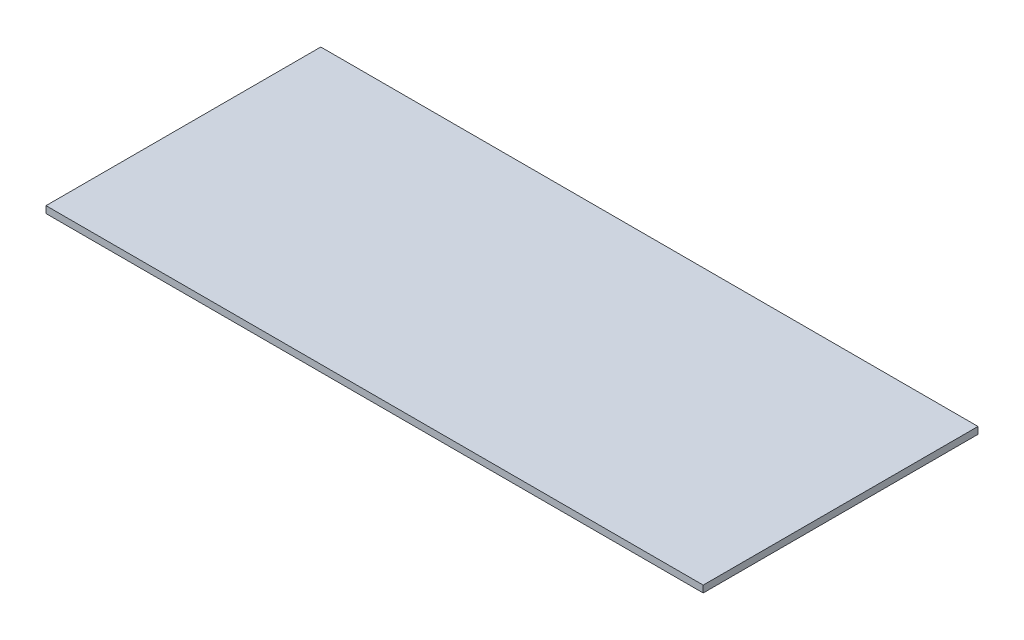
ISO-10303-21;
HEADER;
FILE_DESCRIPTION(('STEP AP214'),'2;1');
FILE_NAME('part.step','',(''),(''),'','','');
FILE_SCHEMA(('AUTOMOTIVE_DESIGN { 1 0 10303 214 1 1 1 1 }'));
ENDSEC;
DATA;
#1=APPLICATION_CONTEXT('core data for automotive mechanical design processes');
#2=APPLICATION_PROTOCOL_DEFINITION('international standard','automotive_design',2000,#1);
#3=PRODUCT_CONTEXT('',#1,'mechanical');
#4=PRODUCT('Part','Part','',(#3));
#5=PRODUCT_RELATED_PRODUCT_CATEGORY('part','',(#4));
#6=PRODUCT_DEFINITION_FORMATION('','',#4);
#7=PRODUCT_DEFINITION_CONTEXT('part definition',#1,'design');
#8=PRODUCT_DEFINITION('design','',#6,#7);
#9=PRODUCT_DEFINITION_SHAPE('','',#8);
#10=(LENGTH_UNIT() NAMED_UNIT(*) SI_UNIT(.MILLI.,.METRE.));
#11=(NAMED_UNIT(*) PLANE_ANGLE_UNIT() SI_UNIT($,.RADIAN.));
#12=(NAMED_UNIT(*) SI_UNIT($,.STERADIAN.) SOLID_ANGLE_UNIT());
#13=UNCERTAINTY_MEASURE_WITH_UNIT(LENGTH_MEASURE(1.E-05),#10,'distance_accuracy_value','');
#14=(GEOMETRIC_REPRESENTATION_CONTEXT(3) GLOBAL_UNCERTAINTY_ASSIGNED_CONTEXT((#13)) GLOBAL_UNIT_ASSIGNED_CONTEXT((#10,
#11,#12)) REPRESENTATION_CONTEXT('',''));
#15=CARTESIAN_POINT('',(0.,0.,0.));
#16=DIRECTION('',(0.,0.,1.));
#17=DIRECTION('',(1.,0.,0.));
#18=AXIS2_PLACEMENT_3D('',#15,#16,#17);
#19=CARTESIAN_POINT('',(143.5,3.,60.));
#20=DIRECTION('',(-1.,0.,0.));
#21=DIRECTION('',(0.,0.,1.));
#22=AXIS2_PLACEMENT_3D('',#19,#20,#21);
#23=PLANE('',#22);
#24=DIRECTION('',(0.,0.,-1.));
#25=VECTOR('',#24,1.);
#26=CARTESIAN_POINT('',(143.5,0.,60.));
#27=LINE('',#26,#25);
#28=CARTESIAN_POINT('',(143.5,0.,60.));
#29=VERTEX_POINT('',#28);
#30=CARTESIAN_POINT('',(143.5,0.,-60.));
#31=VERTEX_POINT('',#30);
#32=EDGE_CURVE('E100',#29,#31,#27,.T.);
#33=ORIENTED_EDGE('',*,*,#32,.T.);
#34=DIRECTION('',(0.,-1.,0.));
#35=VECTOR('',#34,1.);
#36=CARTESIAN_POINT('',(143.5,3.,-60.));
#37=LINE('',#36,#35);
#38=CARTESIAN_POINT('',(143.5,3.,-60.));
#39=VERTEX_POINT('',#38);
#40=EDGE_CURVE('E11',#39,#31,#37,.T.);
#41=ORIENTED_EDGE('',*,*,#40,.F.);
#42=DIRECTION('',(0.,0.,-1.));
#43=VECTOR('',#42,1.);
#44=CARTESIAN_POINT('',(143.5,3.,60.));
#45=LINE('',#44,#43);
#46=CARTESIAN_POINT('',(143.5,3.,60.));
#47=VERTEX_POINT('',#46);
#48=EDGE_CURVE('E88',#47,#39,#45,.T.);
#49=ORIENTED_EDGE('',*,*,#48,.F.);
#50=DIRECTION('',(0.,-1.,0.));
#51=VECTOR('',#50,1.);
#52=CARTESIAN_POINT('',(143.5,3.,60.));
#53=LINE('',#52,#51);
#54=EDGE_CURVE('E96',#47,#29,#53,.T.);
#55=ORIENTED_EDGE('',*,*,#54,.T.);
#56=EDGE_LOOP('',(#33,#41,#49,#55));
#57=FACE_BOUND('',#56,.T.);
#58=ADVANCED_FACE('F37',(#57),#23,.F.);
#59=CARTESIAN_POINT('',(-143.5,3.,-60.));
#60=DIRECTION('',(0.,0.,1.));
#61=DIRECTION('',(1.,0.,0.));
#62=AXIS2_PLACEMENT_3D('',#59,#60,#61);
#63=PLANE('',#62);
#64=DIRECTION('',(-1.,0.,0.));
#65=VECTOR('',#64,1.);
#66=CARTESIAN_POINT('',(-143.5,0.,-60.));
#67=LINE('',#66,#65);
#68=CARTESIAN_POINT('',(-143.5,0.,-60.));
#69=VERTEX_POINT('',#68);
#70=EDGE_CURVE('E92',#31,#69,#67,.T.);
#71=ORIENTED_EDGE('',*,*,#70,.T.);
#72=DIRECTION('',(0.,-1.,0.));
#73=VECTOR('',#72,1.);
#74=CARTESIAN_POINT('',(-143.5,3.,-60.));
#75=LINE('',#74,#73);
#76=CARTESIAN_POINT('',(-143.5,3.,-60.));
#77=VERTEX_POINT('',#76);
#78=EDGE_CURVE('E45',#77,#69,#75,.T.);
#79=ORIENTED_EDGE('',*,*,#78,.F.);
#80=DIRECTION('',(-1.,0.,0.));
#81=VECTOR('',#80,1.);
#82=CARTESIAN_POINT('',(-143.5,3.,-60.));
#83=LINE('',#82,#81);
#84=EDGE_CURVE('E83',#39,#77,#83,.T.);
#85=ORIENTED_EDGE('',*,*,#84,.F.);
#86=ORIENTED_EDGE('',*,*,#40,.T.);
#87=EDGE_LOOP('',(#71,#79,#85,#86));
#88=FACE_BOUND('',#87,.T.);
#89=ADVANCED_FACE('F91',(#88),#63,.F.);
#90=CARTESIAN_POINT('',(-143.5,3.,60.));
#91=DIRECTION('',(1.,0.,0.));
#92=DIRECTION('',(0.,0.,-1.));
#93=AXIS2_PLACEMENT_3D('',#90,#91,#92);
#94=PLANE('',#93);
#95=DIRECTION('',(0.,0.,1.));
#96=VECTOR('',#95,1.);
#97=CARTESIAN_POINT('',(-143.5,0.,60.));
#98=LINE('',#97,#96);
#99=CARTESIAN_POINT('',(-143.5,0.,60.));
#100=VERTEX_POINT('',#99);
#101=EDGE_CURVE('E70',#69,#100,#98,.T.);
#102=ORIENTED_EDGE('',*,*,#101,.T.);
#103=DIRECTION('',(0.,-1.,0.));
#104=VECTOR('',#103,1.);
#105=CARTESIAN_POINT('',(-143.5,3.,60.));
#106=LINE('',#105,#104);
#107=CARTESIAN_POINT('',(-143.5,3.,60.));
#108=VERTEX_POINT('',#107);
#109=EDGE_CURVE('E93',#108,#100,#106,.T.);
#110=ORIENTED_EDGE('',*,*,#109,.F.);
#111=DIRECTION('',(0.,0.,1.));
#112=VECTOR('',#111,1.);
#113=CARTESIAN_POINT('',(-143.5,3.,60.));
#114=LINE('',#113,#112);
#115=EDGE_CURVE('E86',#77,#108,#114,.T.);
#116=ORIENTED_EDGE('',*,*,#115,.F.);
#117=ORIENTED_EDGE('',*,*,#78,.T.);
#118=EDGE_LOOP('',(#102,#110,#116,#117));
#119=FACE_BOUND('',#118,.T.);
#120=ADVANCED_FACE('F94',(#119),#94,.F.);
#121=CARTESIAN_POINT('',(-143.5,3.,60.));
#122=DIRECTION('',(0.,0.,-1.));
#123=DIRECTION('',(-1.,0.,0.));
#124=AXIS2_PLACEMENT_3D('',#121,#122,#123);
#125=PLANE('',#124);
#126=DIRECTION('',(1.,0.,0.));
#127=VECTOR('',#126,1.);
#128=CARTESIAN_POINT('',(-143.5,0.,60.));
#129=LINE('',#128,#127);
#130=EDGE_CURVE('E76',#100,#29,#129,.T.);
#131=ORIENTED_EDGE('',*,*,#130,.T.);
#132=ORIENTED_EDGE('',*,*,#54,.F.);
#133=DIRECTION('',(1.,0.,0.));
#134=VECTOR('',#133,1.);
#135=CARTESIAN_POINT('',(-143.5,3.,60.));
#136=LINE('',#135,#134);
#137=EDGE_CURVE('E53',#108,#47,#136,.T.);
#138=ORIENTED_EDGE('',*,*,#137,.F.);
#139=ORIENTED_EDGE('',*,*,#109,.T.);
#140=EDGE_LOOP('',(#131,#132,#138,#139));
#141=FACE_BOUND('',#140,.T.);
#142=ADVANCED_FACE('F107',(#141),#125,.F.);
#143=CARTESIAN_POINT('',(0.,3.,0.));
#144=DIRECTION('',(0.,-1.,0.));
#145=DIRECTION('',(0.,0.,-1.));
#146=AXIS2_PLACEMENT_3D('',#143,#144,#145);
#147=PLANE('',#146);
#148=ORIENTED_EDGE('',*,*,#48,.T.);
#149=ORIENTED_EDGE('',*,*,#84,.T.);
#150=ORIENTED_EDGE('',*,*,#115,.T.);
#151=ORIENTED_EDGE('',*,*,#137,.T.);
#152=EDGE_LOOP('',(#148,#149,#150,#151));
#153=FACE_BOUND('',#152,.T.);
#154=ADVANCED_FACE('F84',(#153),#147,.F.);
#155=CARTESIAN_POINT('',(0.,0.,0.));
#156=DIRECTION('',(0.,-1.,0.));
#157=DIRECTION('',(0.,0.,-1.));
#158=AXIS2_PLACEMENT_3D('',#155,#156,#157);
#159=PLANE('',#158);
#160=ORIENTED_EDGE('',*,*,#32,.F.);
#161=ORIENTED_EDGE('',*,*,#130,.F.);
#162=ORIENTED_EDGE('',*,*,#101,.F.);
#163=ORIENTED_EDGE('',*,*,#70,.F.);
#164=EDGE_LOOP('',(#160,#161,#162,#163));
#165=FACE_BOUND('',#164,.T.);
#166=ADVANCED_FACE('F110',(#165),#159,.T.);
#167=CLOSED_SHELL('',(#58,#89,#120,#142,#154,#166));
#168=MANIFOLD_SOLID_BREP('B2',#167);
#169=ADVANCED_BREP_SHAPE_REPRESENTATION('',(#18,#168),#14);
#170=SHAPE_DEFINITION_REPRESENTATION(#9,#169);
ENDSEC;
END-ISO-10303-21;
